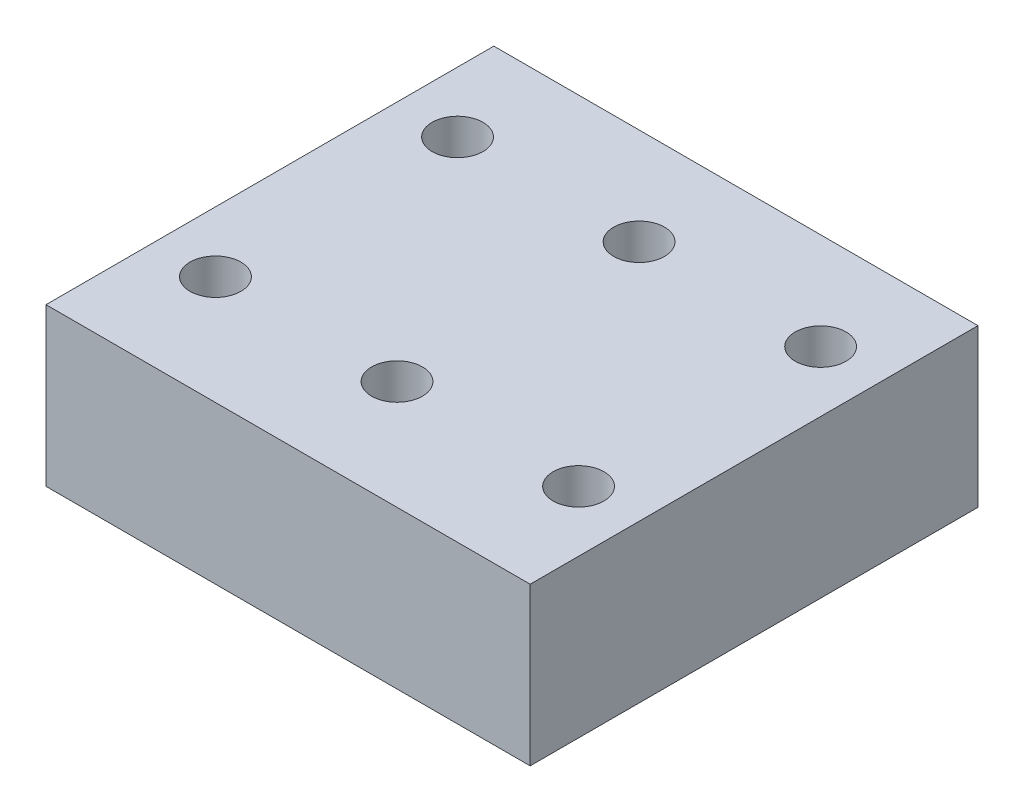
ISO-10303-21;
HEADER;
FILE_DESCRIPTION(('STEP AP214'),'2;1');
FILE_NAME('part.step','',(''),(''),'','','');
FILE_SCHEMA(('AUTOMOTIVE_DESIGN { 1 0 10303 214 1 1 1 1 }'));
ENDSEC;
DATA;
#1=APPLICATION_CONTEXT('core data for automotive mechanical design processes');
#2=APPLICATION_PROTOCOL_DEFINITION('international standard','automotive_design',2000,#1);
#3=PRODUCT_CONTEXT('',#1,'mechanical');
#4=PRODUCT('Part','Part','',(#3));
#5=PRODUCT_RELATED_PRODUCT_CATEGORY('part','',(#4));
#6=PRODUCT_DEFINITION_FORMATION('','',#4);
#7=PRODUCT_DEFINITION_CONTEXT('part definition',#1,'design');
#8=PRODUCT_DEFINITION('design','',#6,#7);
#9=PRODUCT_DEFINITION_SHAPE('','',#8);
#10=(LENGTH_UNIT() NAMED_UNIT(*) SI_UNIT(.MILLI.,.METRE.));
#11=(NAMED_UNIT(*) PLANE_ANGLE_UNIT() SI_UNIT($,.RADIAN.));
#12=(NAMED_UNIT(*) SI_UNIT($,.STERADIAN.) SOLID_ANGLE_UNIT());
#13=UNCERTAINTY_MEASURE_WITH_UNIT(LENGTH_MEASURE(1.E-05),#10,'distance_accuracy_value','');
#14=(GEOMETRIC_REPRESENTATION_CONTEXT(3) GLOBAL_UNCERTAINTY_ASSIGNED_CONTEXT((#13)) GLOBAL_UNIT_ASSIGNED_CONTEXT((#10,
#11,#12)) REPRESENTATION_CONTEXT('',''));
#15=CARTESIAN_POINT('',(0.,0.,0.));
#16=DIRECTION('',(0.,0.,1.));
#17=DIRECTION('',(1.,0.,0.));
#18=AXIS2_PLACEMENT_3D('',#15,#16,#17);
#19=CARTESIAN_POINT('',(0.,13.,0.));
#20=DIRECTION('',(0.,1.,0.));
#21=DIRECTION('',(0.,0.,1.));
#22=AXIS2_PLACEMENT_3D('',#19,#20,#21);
#23=PLANE('',#22);
#24=CARTESIAN_POINT('',(34.9999999999999,13.,8.));
#25=DIRECTION('',(0.,1.,0.));
#26=DIRECTION('',(0.,0.,1.));
#27=AXIS2_PLACEMENT_3D('',#24,#25,#26);
#28=CIRCLE('',#27,2.1);
#29=CARTESIAN_POINT('',(34.9999999999999,13.,5.9));
#30=VERTEX_POINT('',#29);
#31=EDGE_CURVE('E143',#30,#30,#28,.T.);
#32=ORIENTED_EDGE('',*,*,#31,.F.);
#33=EDGE_LOOP('',(#32));
#34=FACE_BOUND('',#33,.T.);
#35=CARTESIAN_POINT('',(19.9999999999999,13.,8.));
#36=DIRECTION('',(0.,1.,0.));
#37=DIRECTION('',(0.,0.,1.));
#38=AXIS2_PLACEMENT_3D('',#35,#36,#37);
#39=CIRCLE('',#38,2.1);
#40=CARTESIAN_POINT('',(19.9999999999999,13.,5.9));
#41=VERTEX_POINT('',#40);
#42=EDGE_CURVE('E131',#41,#41,#39,.T.);
#43=ORIENTED_EDGE('',*,*,#42,.F.);
#44=EDGE_LOOP('',(#43));
#45=FACE_BOUND('',#44,.T.);
#46=CARTESIAN_POINT('',(20.,13.,28.));
#47=DIRECTION('',(0.,1.,0.));
#48=DIRECTION('',(0.,0.,1.));
#49=AXIS2_PLACEMENT_3D('',#46,#47,#48);
#50=CIRCLE('',#49,2.1);
#51=CARTESIAN_POINT('',(20.,13.,25.9));
#52=VERTEX_POINT('',#51);
#53=EDGE_CURVE('E110',#52,#52,#50,.T.);
#54=ORIENTED_EDGE('',*,*,#53,.F.);
#55=EDGE_LOOP('',(#54));
#56=FACE_BOUND('',#55,.T.);
#57=DIRECTION('',(0.,0.,1.));
#58=VECTOR('',#57,1.);
#59=CARTESIAN_POINT('',(0.,13.,0.));
#60=LINE('',#59,#58);
#61=CARTESIAN_POINT('',(0.,13.,0.));
#62=VERTEX_POINT('',#61);
#63=CARTESIAN_POINT('',(0.,13.,37.));
#64=VERTEX_POINT('',#63);
#65=EDGE_CURVE('E95',#62,#64,#60,.T.);
#66=ORIENTED_EDGE('',*,*,#65,.T.);
#67=DIRECTION('',(1.,0.,0.));
#68=VECTOR('',#67,1.);
#69=CARTESIAN_POINT('',(0.,13.,37.));
#70=LINE('',#69,#68);
#71=CARTESIAN_POINT('',(40.,13.,37.));
#72=VERTEX_POINT('',#71);
#73=EDGE_CURVE('E90',#64,#72,#70,.T.);
#74=ORIENTED_EDGE('',*,*,#73,.T.);
#75=DIRECTION('',(0.,0.,-1.));
#76=VECTOR('',#75,1.);
#77=CARTESIAN_POINT('',(40.,13.,0.));
#78=LINE('',#77,#76);
#79=CARTESIAN_POINT('',(40.,13.,0.));
#80=VERTEX_POINT('',#79);
#81=EDGE_CURVE('E93',#72,#80,#78,.T.);
#82=ORIENTED_EDGE('',*,*,#81,.T.);
#83=DIRECTION('',(-1.,0.,0.));
#84=VECTOR('',#83,1.);
#85=CARTESIAN_POINT('',(0.,13.,0.));
#86=LINE('',#85,#84);
#87=EDGE_CURVE('E60',#80,#62,#86,.T.);
#88=ORIENTED_EDGE('',*,*,#87,.T.);
#89=EDGE_LOOP('',(#66,#74,#82,#88));
#90=FACE_BOUND('',#89,.T.);
#91=CARTESIAN_POINT('',(5.,13.,28.));
#92=DIRECTION('',(0.,1.,0.));
#93=DIRECTION('',(0.,0.,-1.));
#94=AXIS2_PLACEMENT_3D('',#91,#92,#93);
#95=CIRCLE('',#94,2.1);
#96=CARTESIAN_POINT('',(5.,13.,25.9));
#97=VERTEX_POINT('',#96);
#98=EDGE_CURVE('E125',#97,#97,#95,.T.);
#99=ORIENTED_EDGE('',*,*,#98,.F.);
#100=EDGE_LOOP('',(#99));
#101=FACE_BOUND('',#100,.T.);
#102=CARTESIAN_POINT('',(35.,13.,28.));
#103=DIRECTION('',(0.,1.,0.));
#104=DIRECTION('',(0.,0.,1.));
#105=AXIS2_PLACEMENT_3D('',#102,#103,#104);
#106=CIRCLE('',#105,2.1);
#107=CARTESIAN_POINT('',(35.,13.,25.9));
#108=VERTEX_POINT('',#107);
#109=EDGE_CURVE('E137',#108,#108,#106,.T.);
#110=ORIENTED_EDGE('',*,*,#109,.F.);
#111=EDGE_LOOP('',(#110));
#112=FACE_BOUND('',#111,.T.);
#113=CARTESIAN_POINT('',(5.00000000000007,13.,8.));
#114=DIRECTION('',(0.,1.,0.));
#115=DIRECTION('',(0.,0.,-1.));
#116=AXIS2_PLACEMENT_3D('',#113,#114,#115);
#117=CIRCLE('',#116,2.1);
#118=CARTESIAN_POINT('',(5.00000000000007,13.,5.9));
#119=VERTEX_POINT('',#118);
#120=EDGE_CURVE('E149',#119,#119,#117,.T.);
#121=ORIENTED_EDGE('',*,*,#120,.F.);
#122=EDGE_LOOP('',(#121));
#123=FACE_BOUND('',#122,.T.);
#124=ADVANCED_FACE('F43',(#34,#45,#56,#90,#101,#112,#123),#23,.T.);
#125=CARTESIAN_POINT('',(0.,0.,0.));
#126=DIRECTION('',(0.,1.,0.));
#127=DIRECTION('',(0.,0.,1.));
#128=AXIS2_PLACEMENT_3D('',#125,#126,#127);
#129=PLANE('',#128);
#130=DIRECTION('',(0.,0.,1.));
#131=VECTOR('',#130,1.);
#132=CARTESIAN_POINT('',(0.,0.,0.));
#133=LINE('',#132,#131);
#134=CARTESIAN_POINT('',(0.,0.,0.));
#135=VERTEX_POINT('',#134);
#136=CARTESIAN_POINT('',(0.,0.,37.));
#137=VERTEX_POINT('',#136);
#138=EDGE_CURVE('E107',#135,#137,#133,.T.);
#139=ORIENTED_EDGE('',*,*,#138,.F.);
#140=DIRECTION('',(-1.,0.,0.));
#141=VECTOR('',#140,1.);
#142=CARTESIAN_POINT('',(0.,0.,0.));
#143=LINE('',#142,#141);
#144=CARTESIAN_POINT('',(40.,0.,0.));
#145=VERTEX_POINT('',#144);
#146=EDGE_CURVE('E83',#145,#135,#143,.T.);
#147=ORIENTED_EDGE('',*,*,#146,.F.);
#148=DIRECTION('',(0.,0.,-1.));
#149=VECTOR('',#148,1.);
#150=CARTESIAN_POINT('',(40.,0.,0.));
#151=LINE('',#150,#149);
#152=CARTESIAN_POINT('',(40.,0.,37.));
#153=VERTEX_POINT('',#152);
#154=EDGE_CURVE('E77',#153,#145,#151,.T.);
#155=ORIENTED_EDGE('',*,*,#154,.F.);
#156=DIRECTION('',(1.,0.,0.));
#157=VECTOR('',#156,1.);
#158=CARTESIAN_POINT('',(0.,0.,37.));
#159=LINE('',#158,#157);
#160=EDGE_CURVE('E99',#137,#153,#159,.T.);
#161=ORIENTED_EDGE('',*,*,#160,.F.);
#162=EDGE_LOOP('',(#139,#147,#155,#161));
#163=FACE_BOUND('',#162,.T.);
#164=CARTESIAN_POINT('',(20.,0.,28.));
#165=DIRECTION('',(0.,1.,0.));
#166=DIRECTION('',(0.,0.,1.));
#167=AXIS2_PLACEMENT_3D('',#164,#165,#166);
#168=CIRCLE('',#167,2.1);
#169=CARTESIAN_POINT('',(20.,0.,25.9));
#170=VERTEX_POINT('',#169);
#171=EDGE_CURVE('E122',#170,#170,#168,.T.);
#172=ORIENTED_EDGE('',*,*,#171,.T.);
#173=EDGE_LOOP('',(#172));
#174=FACE_BOUND('',#173,.T.);
#175=CARTESIAN_POINT('',(5.,0.,28.));
#176=DIRECTION('',(0.,1.,0.));
#177=DIRECTION('',(0.,0.,-1.));
#178=AXIS2_PLACEMENT_3D('',#175,#176,#177);
#179=CIRCLE('',#178,2.1);
#180=CARTESIAN_POINT('',(5.,0.,25.9));
#181=VERTEX_POINT('',#180);
#182=EDGE_CURVE('E128',#181,#181,#179,.T.);
#183=ORIENTED_EDGE('',*,*,#182,.T.);
#184=EDGE_LOOP('',(#183));
#185=FACE_BOUND('',#184,.T.);
#186=CARTESIAN_POINT('',(19.9999999999999,0.,8.));
#187=DIRECTION('',(0.,1.,0.));
#188=DIRECTION('',(0.,0.,1.));
#189=AXIS2_PLACEMENT_3D('',#186,#187,#188);
#190=CIRCLE('',#189,2.1);
#191=CARTESIAN_POINT('',(19.9999999999999,0.,5.9));
#192=VERTEX_POINT('',#191);
#193=EDGE_CURVE('E134',#192,#192,#190,.T.);
#194=ORIENTED_EDGE('',*,*,#193,.T.);
#195=EDGE_LOOP('',(#194));
#196=FACE_BOUND('',#195,.T.);
#197=CARTESIAN_POINT('',(35.,0.,28.));
#198=DIRECTION('',(0.,1.,0.));
#199=DIRECTION('',(0.,0.,1.));
#200=AXIS2_PLACEMENT_3D('',#197,#198,#199);
#201=CIRCLE('',#200,2.1);
#202=CARTESIAN_POINT('',(35.,0.,25.9));
#203=VERTEX_POINT('',#202);
#204=EDGE_CURVE('E140',#203,#203,#201,.T.);
#205=ORIENTED_EDGE('',*,*,#204,.T.);
#206=EDGE_LOOP('',(#205));
#207=FACE_BOUND('',#206,.T.);
#208=CARTESIAN_POINT('',(34.9999999999999,0.,8.));
#209=DIRECTION('',(0.,1.,0.));
#210=DIRECTION('',(0.,0.,1.));
#211=AXIS2_PLACEMENT_3D('',#208,#209,#210);
#212=CIRCLE('',#211,2.1);
#213=CARTESIAN_POINT('',(34.9999999999999,0.,5.9));
#214=VERTEX_POINT('',#213);
#215=EDGE_CURVE('E146',#214,#214,#212,.T.);
#216=ORIENTED_EDGE('',*,*,#215,.T.);
#217=EDGE_LOOP('',(#216));
#218=FACE_BOUND('',#217,.T.);
#219=CARTESIAN_POINT('',(5.00000000000007,0.,8.));
#220=DIRECTION('',(0.,1.,0.));
#221=DIRECTION('',(0.,0.,-1.));
#222=AXIS2_PLACEMENT_3D('',#219,#220,#221);
#223=CIRCLE('',#222,2.1);
#224=CARTESIAN_POINT('',(5.00000000000007,0.,5.9));
#225=VERTEX_POINT('',#224);
#226=EDGE_CURVE('E152',#225,#225,#223,.T.);
#227=ORIENTED_EDGE('',*,*,#226,.T.);
#228=EDGE_LOOP('',(#227));
#229=FACE_BOUND('',#228,.T.);
#230=ADVANCED_FACE('F118',(#163,#174,#185,#196,#207,#218,#229),#129,.F.);
#231=CARTESIAN_POINT('',(0.,13.,0.));
#232=DIRECTION('',(1.,0.,0.));
#233=DIRECTION('',(0.,0.,-1.));
#234=AXIS2_PLACEMENT_3D('',#231,#232,#233);
#235=PLANE('',#234);
#236=ORIENTED_EDGE('',*,*,#138,.T.);
#237=DIRECTION('',(0.,-1.,0.));
#238=VECTOR('',#237,1.);
#239=CARTESIAN_POINT('',(0.,13.,37.));
#240=LINE('',#239,#238);
#241=EDGE_CURVE('E11',#64,#137,#240,.T.);
#242=ORIENTED_EDGE('',*,*,#241,.F.);
#243=ORIENTED_EDGE('',*,*,#65,.F.);
#244=DIRECTION('',(0.,-1.,0.));
#245=VECTOR('',#244,1.);
#246=CARTESIAN_POINT('',(0.,13.,0.));
#247=LINE('',#246,#245);
#248=EDGE_CURVE('E103',#62,#135,#247,.T.);
#249=ORIENTED_EDGE('',*,*,#248,.T.);
#250=EDGE_LOOP('',(#236,#242,#243,#249));
#251=FACE_BOUND('',#250,.T.);
#252=ADVANCED_FACE('F45',(#251),#235,.F.);
#253=CARTESIAN_POINT('',(0.,13.,37.));
#254=DIRECTION('',(0.,0.,-1.));
#255=DIRECTION('',(-1.,0.,0.));
#256=AXIS2_PLACEMENT_3D('',#253,#254,#255);
#257=PLANE('',#256);
#258=ORIENTED_EDGE('',*,*,#160,.T.);
#259=DIRECTION('',(0.,-1.,0.));
#260=VECTOR('',#259,1.);
#261=CARTESIAN_POINT('',(40.,13.,37.));
#262=LINE('',#261,#260);
#263=EDGE_CURVE('E52',#72,#153,#262,.T.);
#264=ORIENTED_EDGE('',*,*,#263,.F.);
#265=ORIENTED_EDGE('',*,*,#73,.F.);
#266=ORIENTED_EDGE('',*,*,#241,.T.);
#267=EDGE_LOOP('',(#258,#264,#265,#266));
#268=FACE_BOUND('',#267,.T.);
#269=ADVANCED_FACE('F98',(#268),#257,.F.);
#270=CARTESIAN_POINT('',(40.,13.,0.));
#271=DIRECTION('',(-1.,0.,0.));
#272=DIRECTION('',(0.,0.,1.));
#273=AXIS2_PLACEMENT_3D('',#270,#271,#272);
#274=PLANE('',#273);
#275=ORIENTED_EDGE('',*,*,#154,.T.);
#276=DIRECTION('',(0.,-1.,0.));
#277=VECTOR('',#276,1.);
#278=CARTESIAN_POINT('',(40.,13.,0.));
#279=LINE('',#278,#277);
#280=EDGE_CURVE('E100',#80,#145,#279,.T.);
#281=ORIENTED_EDGE('',*,*,#280,.F.);
#282=ORIENTED_EDGE('',*,*,#81,.F.);
#283=ORIENTED_EDGE('',*,*,#263,.T.);
#284=EDGE_LOOP('',(#275,#281,#282,#283));
#285=FACE_BOUND('',#284,.T.);
#286=ADVANCED_FACE('F101',(#285),#274,.F.);
#287=CARTESIAN_POINT('',(0.,13.,0.));
#288=DIRECTION('',(0.,0.,1.));
#289=DIRECTION('',(1.,0.,0.));
#290=AXIS2_PLACEMENT_3D('',#287,#288,#289);
#291=PLANE('',#290);
#292=ORIENTED_EDGE('',*,*,#146,.T.);
#293=ORIENTED_EDGE('',*,*,#248,.F.);
#294=ORIENTED_EDGE('',*,*,#87,.F.);
#295=ORIENTED_EDGE('',*,*,#280,.T.);
#296=EDGE_LOOP('',(#292,#293,#294,#295));
#297=FACE_BOUND('',#296,.T.);
#298=ADVANCED_FACE('F115',(#297),#291,.F.);
#299=CARTESIAN_POINT('',(20.,13.,28.));
#300=DIRECTION('',(0.,-1.,0.));
#301=DIRECTION('',(0.,0.,-1.));
#302=AXIS2_PLACEMENT_3D('',#299,#300,#301);
#303=CYLINDRICAL_SURFACE('',#302,2.1);
#304=CARTESIAN_POINT('',(20.,13.,25.9));
#305=CARTESIAN_POINT('',(20.,12.8645833333333,25.9));
#306=CARTESIAN_POINT('',(20.,12.7291666666667,25.9));
#307=CARTESIAN_POINT('',(20.,12.4583333333333,25.9));
#308=CARTESIAN_POINT('',(20.,12.3229166666667,25.9));
#309=CARTESIAN_POINT('',(20.,12.0520833333333,25.9));
#310=CARTESIAN_POINT('',(20.,11.9166666666667,25.9));
#311=CARTESIAN_POINT('',(20.,11.6458333333333,25.9));
#312=CARTESIAN_POINT('',(20.,11.5104166666667,25.9));
#313=CARTESIAN_POINT('',(20.,11.2395833333333,25.9));
#314=CARTESIAN_POINT('',(20.,11.1041666666667,25.9));
#315=CARTESIAN_POINT('',(20.,10.8333333333333,25.9));
#316=CARTESIAN_POINT('',(20.,10.6979166666667,25.9));
#317=CARTESIAN_POINT('',(20.,10.4270833333333,25.9));
#318=CARTESIAN_POINT('',(20.,10.2916666666667,25.9));
#319=CARTESIAN_POINT('',(20.,10.0208333333333,25.9));
#320=CARTESIAN_POINT('',(20.,9.88541666666667,25.9));
#321=CARTESIAN_POINT('',(20.,9.61458333333333,25.9));
#322=CARTESIAN_POINT('',(20.,9.47916666666667,25.9));
#323=CARTESIAN_POINT('',(20.,9.20833333333333,25.9));
#324=CARTESIAN_POINT('',(20.,9.07291666666666,25.9));
#325=CARTESIAN_POINT('',(20.,8.80208333333333,25.9));
#326=CARTESIAN_POINT('',(20.,8.66666666666667,25.9));
#327=CARTESIAN_POINT('',(20.,8.39583333333333,25.9));
#328=CARTESIAN_POINT('',(20.,8.26041666666667,25.9));
#329=CARTESIAN_POINT('',(20.,7.98958333333333,25.9));
#330=CARTESIAN_POINT('',(20.,7.85416666666667,25.9));
#331=CARTESIAN_POINT('',(20.,7.58333333333333,25.9));
#332=CARTESIAN_POINT('',(20.,7.44791666666667,25.9));
#333=CARTESIAN_POINT('',(20.,7.17708333333333,25.9));
#334=CARTESIAN_POINT('',(20.,7.04166666666667,25.9));
#335=CARTESIAN_POINT('',(20.,6.77083333333333,25.9));
#336=CARTESIAN_POINT('',(20.,6.63541666666667,25.9));
#337=CARTESIAN_POINT('',(20.,6.36458333333333,25.9));
#338=CARTESIAN_POINT('',(20.,6.22916666666667,25.9));
#339=CARTESIAN_POINT('',(20.,5.95833333333333,25.9));
#340=CARTESIAN_POINT('',(20.,5.82291666666667,25.9));
#341=CARTESIAN_POINT('',(20.,5.55208333333333,25.9));
#342=CARTESIAN_POINT('',(20.,5.41666666666667,25.9));
#343=CARTESIAN_POINT('',(20.,5.14583333333333,25.9));
#344=CARTESIAN_POINT('',(20.,5.01041666666667,25.9));
#345=CARTESIAN_POINT('',(20.,4.73958333333333,25.9));
#346=CARTESIAN_POINT('',(20.,4.60416666666667,25.9));
#347=CARTESIAN_POINT('',(20.,4.33333333333333,25.9));
#348=CARTESIAN_POINT('',(20.,4.19791666666667,25.9));
#349=CARTESIAN_POINT('',(20.,3.92708333333333,25.9));
#350=CARTESIAN_POINT('',(20.,3.79166666666667,25.9));
#351=CARTESIAN_POINT('',(20.,3.52083333333333,25.9));
#352=CARTESIAN_POINT('',(20.,3.38541666666667,25.9));
#353=CARTESIAN_POINT('',(20.,3.11458333333333,25.9));
#354=CARTESIAN_POINT('',(20.,2.97916666666667,25.9));
#355=CARTESIAN_POINT('',(20.,2.70833333333333,25.9));
#356=CARTESIAN_POINT('',(20.,2.57291666666667,25.9));
#357=CARTESIAN_POINT('',(20.,2.30208333333333,25.9));
#358=CARTESIAN_POINT('',(20.,2.16666666666667,25.9));
#359=CARTESIAN_POINT('',(20.,1.89583333333333,25.9));
#360=CARTESIAN_POINT('',(20.,1.76041666666667,25.9));
#361=CARTESIAN_POINT('',(20.,1.48958333333333,25.9));
#362=CARTESIAN_POINT('',(20.,1.35416666666667,25.9));
#363=CARTESIAN_POINT('',(20.,1.08333333333333,25.9));
#364=CARTESIAN_POINT('',(20.,0.947916666666667,25.9));
#365=CARTESIAN_POINT('',(20.,0.677083333333334,25.9));
#366=CARTESIAN_POINT('',(20.,0.541666666666667,25.9));
#367=CARTESIAN_POINT('',(20.,0.270833333333334,25.9));
#368=CARTESIAN_POINT('',(20.,0.135416666666667,25.9));
#369=CARTESIAN_POINT('',(20.,0.,25.9));
#370=B_SPLINE_CURVE_WITH_KNOTS('',3,(#304,#305,#306,#307,#308,#309,#310,#311,#312,#313,#314,
#315,#316,#317,#318,#319,#320,#321,#322,#323,#324,#325,#326,#327,#328,#329,#330,#331,#332,#333,
#334,#335,#336,#337,#338,#339,#340,#341,#342,#343,#344,#345,#346,#347,#348,#349,#350,#351,#352,
#353,#354,#355,#356,#357,#358,#359,#360,#361,#362,#363,#364,#365,#366,#367,#368,#369),
.UNSPECIFIED.,.F.,.F.,(4,2,2,2,2,2,2,2,2,2,2,2,2,2,2,2,2,2,2,2,2,2,2,2,2,2,2,2,2,2,2,2,4),(0.,
0.40625,0.812500000000001,1.21875,1.625,2.03125,2.4375,2.84375,3.25,3.65625,4.0625,4.46875,
4.875,5.28125,5.6875,6.09375,6.5,6.90625,7.3125,7.71875,8.125,8.53125,8.9375,9.34375,9.75,
10.15625,10.5625,10.96875,11.375,11.78125,12.1875,12.59375,13.),.UNSPECIFIED.);
#371=EDGE_CURVE('BSEAM171',#52,#170,#370,.T.);
#372=ORIENTED_EDGE('',*,*,#53,.T.);
#373=ORIENTED_EDGE('',*,*,#171,.F.);
#374=ORIENTED_EDGE('',*,*,#371,.T.);
#375=ORIENTED_EDGE('',*,*,#371,.F.);
#376=EDGE_LOOP('',(#372,#374,#373,#375));
#377=FACE_BOUND('',#376,.T.);
#378=ADVANCED_FACE('F171',(#377),#303,.F.);
#379=CARTESIAN_POINT('',(5.,13.,28.));
#380=DIRECTION('',(0.,-1.,0.));
#381=DIRECTION('',(0.,0.,-1.));
#382=AXIS2_PLACEMENT_3D('',#379,#380,#381);
#383=CYLINDRICAL_SURFACE('',#382,2.1);
#384=CARTESIAN_POINT('',(5.,13.,25.9));
#385=CARTESIAN_POINT('',(5.,12.8645833333333,25.9));
#386=CARTESIAN_POINT('',(5.,12.7291666666667,25.9));
#387=CARTESIAN_POINT('',(5.,12.4583333333333,25.9));
#388=CARTESIAN_POINT('',(5.,12.3229166666667,25.9));
#389=CARTESIAN_POINT('',(5.,12.0520833333333,25.9));
#390=CARTESIAN_POINT('',(5.,11.9166666666667,25.9));
#391=CARTESIAN_POINT('',(5.,11.6458333333333,25.9));
#392=CARTESIAN_POINT('',(5.,11.5104166666667,25.9));
#393=CARTESIAN_POINT('',(5.,11.2395833333333,25.9));
#394=CARTESIAN_POINT('',(5.,11.1041666666667,25.9));
#395=CARTESIAN_POINT('',(5.,10.8333333333333,25.9));
#396=CARTESIAN_POINT('',(5.,10.6979166666667,25.9));
#397=CARTESIAN_POINT('',(5.,10.4270833333333,25.9));
#398=CARTESIAN_POINT('',(5.,10.2916666666667,25.9));
#399=CARTESIAN_POINT('',(5.,10.0208333333333,25.9));
#400=CARTESIAN_POINT('',(5.,9.88541666666667,25.9));
#401=CARTESIAN_POINT('',(5.,9.61458333333333,25.9));
#402=CARTESIAN_POINT('',(5.,9.47916666666667,25.9));
#403=CARTESIAN_POINT('',(5.,9.20833333333333,25.9));
#404=CARTESIAN_POINT('',(5.,9.07291666666666,25.9));
#405=CARTESIAN_POINT('',(5.,8.80208333333333,25.9));
#406=CARTESIAN_POINT('',(5.,8.66666666666667,25.9));
#407=CARTESIAN_POINT('',(5.,8.39583333333333,25.9));
#408=CARTESIAN_POINT('',(5.,8.26041666666667,25.9));
#409=CARTESIAN_POINT('',(5.,7.98958333333333,25.9));
#410=CARTESIAN_POINT('',(5.,7.85416666666667,25.9));
#411=CARTESIAN_POINT('',(5.,7.58333333333333,25.9));
#412=CARTESIAN_POINT('',(5.,7.44791666666667,25.9));
#413=CARTESIAN_POINT('',(5.,7.17708333333333,25.9));
#414=CARTESIAN_POINT('',(5.,7.04166666666667,25.9));
#415=CARTESIAN_POINT('',(5.,6.77083333333333,25.9));
#416=CARTESIAN_POINT('',(5.,6.63541666666667,25.9));
#417=CARTESIAN_POINT('',(5.,6.36458333333333,25.9));
#418=CARTESIAN_POINT('',(5.,6.22916666666667,25.9));
#419=CARTESIAN_POINT('',(5.,5.95833333333333,25.9));
#420=CARTESIAN_POINT('',(5.,5.82291666666667,25.9));
#421=CARTESIAN_POINT('',(5.,5.55208333333333,25.9));
#422=CARTESIAN_POINT('',(5.,5.41666666666667,25.9));
#423=CARTESIAN_POINT('',(5.,5.14583333333333,25.9));
#424=CARTESIAN_POINT('',(5.,5.01041666666667,25.9));
#425=CARTESIAN_POINT('',(5.,4.73958333333333,25.9));
#426=CARTESIAN_POINT('',(5.,4.60416666666667,25.9));
#427=CARTESIAN_POINT('',(5.,4.33333333333333,25.9));
#428=CARTESIAN_POINT('',(5.,4.19791666666667,25.9));
#429=CARTESIAN_POINT('',(5.,3.92708333333333,25.9));
#430=CARTESIAN_POINT('',(5.,3.79166666666667,25.9));
#431=CARTESIAN_POINT('',(5.,3.52083333333333,25.9));
#432=CARTESIAN_POINT('',(5.,3.38541666666667,25.9));
#433=CARTESIAN_POINT('',(5.,3.11458333333333,25.9));
#434=CARTESIAN_POINT('',(5.,2.97916666666667,25.9));
#435=CARTESIAN_POINT('',(5.,2.70833333333333,25.9));
#436=CARTESIAN_POINT('',(5.,2.57291666666667,25.9));
#437=CARTESIAN_POINT('',(5.,2.30208333333333,25.9));
#438=CARTESIAN_POINT('',(5.,2.16666666666667,25.9));
#439=CARTESIAN_POINT('',(5.,1.89583333333333,25.9));
#440=CARTESIAN_POINT('',(5.,1.76041666666667,25.9));
#441=CARTESIAN_POINT('',(5.,1.48958333333333,25.9));
#442=CARTESIAN_POINT('',(5.,1.35416666666667,25.9));
#443=CARTESIAN_POINT('',(5.,1.08333333333333,25.9));
#444=CARTESIAN_POINT('',(5.,0.947916666666667,25.9));
#445=CARTESIAN_POINT('',(5.,0.677083333333334,25.9));
#446=CARTESIAN_POINT('',(5.,0.541666666666667,25.9));
#447=CARTESIAN_POINT('',(5.,0.270833333333334,25.9));
#448=CARTESIAN_POINT('',(5.,0.135416666666667,25.9));
#449=CARTESIAN_POINT('',(5.,0.,25.9));
#450=B_SPLINE_CURVE_WITH_KNOTS('',3,(#384,#385,#386,#387,#388,#389,#390,#391,#392,#393,#394,
#395,#396,#397,#398,#399,#400,#401,#402,#403,#404,#405,#406,#407,#408,#409,#410,#411,#412,#413,
#414,#415,#416,#417,#418,#419,#420,#421,#422,#423,#424,#425,#426,#427,#428,#429,#430,#431,#432,
#433,#434,#435,#436,#437,#438,#439,#440,#441,#442,#443,#444,#445,#446,#447,#448,#449),
.UNSPECIFIED.,.F.,.F.,(4,2,2,2,2,2,2,2,2,2,2,2,2,2,2,2,2,2,2,2,2,2,2,2,2,2,2,2,2,2,2,2,4),(0.,
0.40625,0.812500000000001,1.21875,1.625,2.03125,2.4375,2.84375,3.25,3.65625,4.0625,4.46875,
4.875,5.28125,5.6875,6.09375,6.5,6.90625,7.3125,7.71875,8.125,8.53125,8.9375,9.34375,9.75,
10.15625,10.5625,10.96875,11.375,11.78125,12.1875,12.59375,13.),.UNSPECIFIED.);
#451=EDGE_CURVE('BSEAM216',#97,#181,#450,.T.);
#452=ORIENTED_EDGE('',*,*,#98,.T.);
#453=ORIENTED_EDGE('',*,*,#182,.F.);
#454=ORIENTED_EDGE('',*,*,#451,.T.);
#455=ORIENTED_EDGE('',*,*,#451,.F.);
#456=EDGE_LOOP('',(#452,#454,#453,#455));
#457=FACE_BOUND('',#456,.T.);
#458=ADVANCED_FACE('F216',(#457),#383,.F.);
#459=CARTESIAN_POINT('',(19.9999999999999,13.,8.));
#460=DIRECTION('',(0.,-1.,0.));
#461=DIRECTION('',(0.,0.,-1.));
#462=AXIS2_PLACEMENT_3D('',#459,#460,#461);
#463=CYLINDRICAL_SURFACE('',#462,2.1);
#464=CARTESIAN_POINT('',(19.9999999999999,13.,5.9));
#465=CARTESIAN_POINT('',(19.9999999999999,12.8645833333333,5.9));
#466=CARTESIAN_POINT('',(19.9999999999999,12.7291666666667,5.9));
#467=CARTESIAN_POINT('',(19.9999999999999,12.4583333333333,5.9));
#468=CARTESIAN_POINT('',(19.9999999999999,12.3229166666667,5.9));
#469=CARTESIAN_POINT('',(19.9999999999999,12.0520833333333,5.9));
#470=CARTESIAN_POINT('',(19.9999999999999,11.9166666666667,5.9));
#471=CARTESIAN_POINT('',(19.9999999999999,11.6458333333333,5.9));
#472=CARTESIAN_POINT('',(19.9999999999999,11.5104166666667,5.9));
#473=CARTESIAN_POINT('',(19.9999999999999,11.2395833333333,5.9));
#474=CARTESIAN_POINT('',(19.9999999999999,11.1041666666667,5.9));
#475=CARTESIAN_POINT('',(19.9999999999999,10.8333333333333,5.9));
#476=CARTESIAN_POINT('',(19.9999999999999,10.6979166666667,5.9));
#477=CARTESIAN_POINT('',(19.9999999999999,10.4270833333333,5.9));
#478=CARTESIAN_POINT('',(19.9999999999999,10.2916666666667,5.9));
#479=CARTESIAN_POINT('',(19.9999999999999,10.0208333333333,5.9));
#480=CARTESIAN_POINT('',(19.9999999999999,9.88541666666667,5.9));
#481=CARTESIAN_POINT('',(19.9999999999999,9.61458333333333,5.9));
#482=CARTESIAN_POINT('',(19.9999999999999,9.47916666666667,5.9));
#483=CARTESIAN_POINT('',(19.9999999999999,9.20833333333333,5.9));
#484=CARTESIAN_POINT('',(19.9999999999999,9.07291666666666,5.9));
#485=CARTESIAN_POINT('',(19.9999999999999,8.80208333333333,5.9));
#486=CARTESIAN_POINT('',(19.9999999999999,8.66666666666667,5.9));
#487=CARTESIAN_POINT('',(19.9999999999999,8.39583333333333,5.9));
#488=CARTESIAN_POINT('',(19.9999999999999,8.26041666666667,5.9));
#489=CARTESIAN_POINT('',(19.9999999999999,7.98958333333333,5.9));
#490=CARTESIAN_POINT('',(19.9999999999999,7.85416666666667,5.9));
#491=CARTESIAN_POINT('',(19.9999999999999,7.58333333333333,5.9));
#492=CARTESIAN_POINT('',(19.9999999999999,7.44791666666667,5.9));
#493=CARTESIAN_POINT('',(19.9999999999999,7.17708333333333,5.9));
#494=CARTESIAN_POINT('',(19.9999999999999,7.04166666666667,5.9));
#495=CARTESIAN_POINT('',(19.9999999999999,6.77083333333333,5.9));
#496=CARTESIAN_POINT('',(19.9999999999999,6.63541666666667,5.9));
#497=CARTESIAN_POINT('',(19.9999999999999,6.36458333333333,5.9));
#498=CARTESIAN_POINT('',(19.9999999999999,6.22916666666667,5.9));
#499=CARTESIAN_POINT('',(19.9999999999999,5.95833333333333,5.9));
#500=CARTESIAN_POINT('',(19.9999999999999,5.82291666666667,5.9));
#501=CARTESIAN_POINT('',(19.9999999999999,5.55208333333333,5.9));
#502=CARTESIAN_POINT('',(19.9999999999999,5.41666666666667,5.9));
#503=CARTESIAN_POINT('',(19.9999999999999,5.14583333333333,5.9));
#504=CARTESIAN_POINT('',(19.9999999999999,5.01041666666667,5.9));
#505=CARTESIAN_POINT('',(19.9999999999999,4.73958333333333,5.9));
#506=CARTESIAN_POINT('',(19.9999999999999,4.60416666666667,5.9));
#507=CARTESIAN_POINT('',(19.9999999999999,4.33333333333333,5.9));
#508=CARTESIAN_POINT('',(19.9999999999999,4.19791666666667,5.9));
#509=CARTESIAN_POINT('',(19.9999999999999,3.92708333333333,5.9));
#510=CARTESIAN_POINT('',(19.9999999999999,3.79166666666667,5.9));
#511=CARTESIAN_POINT('',(19.9999999999999,3.52083333333333,5.9));
#512=CARTESIAN_POINT('',(19.9999999999999,3.38541666666667,5.9));
#513=CARTESIAN_POINT('',(19.9999999999999,3.11458333333333,5.9));
#514=CARTESIAN_POINT('',(19.9999999999999,2.97916666666667,5.9));
#515=CARTESIAN_POINT('',(19.9999999999999,2.70833333333333,5.9));
#516=CARTESIAN_POINT('',(19.9999999999999,2.57291666666667,5.9));
#517=CARTESIAN_POINT('',(19.9999999999999,2.30208333333333,5.9));
#518=CARTESIAN_POINT('',(19.9999999999999,2.16666666666667,5.9));
#519=CARTESIAN_POINT('',(19.9999999999999,1.89583333333333,5.9));
#520=CARTESIAN_POINT('',(19.9999999999999,1.76041666666667,5.9));
#521=CARTESIAN_POINT('',(19.9999999999999,1.48958333333333,5.9));
#522=CARTESIAN_POINT('',(19.9999999999999,1.35416666666667,5.9));
#523=CARTESIAN_POINT('',(19.9999999999999,1.08333333333333,5.9));
#524=CARTESIAN_POINT('',(19.9999999999999,0.947916666666667,5.9));
#525=CARTESIAN_POINT('',(19.9999999999999,0.677083333333334,5.9));
#526=CARTESIAN_POINT('',(19.9999999999999,0.541666666666667,5.9));
#527=CARTESIAN_POINT('',(19.9999999999999,0.270833333333334,5.9));
#528=CARTESIAN_POINT('',(19.9999999999999,0.135416666666667,5.9));
#529=CARTESIAN_POINT('',(19.9999999999999,0.,5.9));
#530=B_SPLINE_CURVE_WITH_KNOTS('',3,(#464,#465,#466,#467,#468,#469,#470,#471,#472,#473,#474,
#475,#476,#477,#478,#479,#480,#481,#482,#483,#484,#485,#486,#487,#488,#489,#490,#491,#492,#493,
#494,#495,#496,#497,#498,#499,#500,#501,#502,#503,#504,#505,#506,#507,#508,#509,#510,#511,#512,
#513,#514,#515,#516,#517,#518,#519,#520,#521,#522,#523,#524,#525,#526,#527,#528,#529),
.UNSPECIFIED.,.F.,.F.,(4,2,2,2,2,2,2,2,2,2,2,2,2,2,2,2,2,2,2,2,2,2,2,2,2,2,2,2,2,2,2,2,4),(0.,
0.40625,0.812500000000001,1.21875,1.625,2.03125,2.4375,2.84375,3.25,3.65625,4.0625,4.46875,
4.875,5.28125,5.6875,6.09375,6.5,6.90625,7.3125,7.71875,8.125,8.53125,8.9375,9.34375,9.75,
10.15625,10.5625,10.96875,11.375,11.78125,12.1875,12.59375,13.),.UNSPECIFIED.);
#531=EDGE_CURVE('BSEAM224',#41,#192,#530,.T.);
#532=ORIENTED_EDGE('',*,*,#42,.T.);
#533=ORIENTED_EDGE('',*,*,#193,.F.);
#534=ORIENTED_EDGE('',*,*,#531,.T.);
#535=ORIENTED_EDGE('',*,*,#531,.F.);
#536=EDGE_LOOP('',(#532,#534,#533,#535));
#537=FACE_BOUND('',#536,.T.);
#538=ADVANCED_FACE('F224',(#537),#463,.F.);
#539=CARTESIAN_POINT('',(35.,13.,28.));
#540=DIRECTION('',(0.,-1.,0.));
#541=DIRECTION('',(0.,0.,-1.));
#542=AXIS2_PLACEMENT_3D('',#539,#540,#541);
#543=CYLINDRICAL_SURFACE('',#542,2.1);
#544=CARTESIAN_POINT('',(35.,13.,25.9));
#545=CARTESIAN_POINT('',(35.,12.8645833333333,25.9));
#546=CARTESIAN_POINT('',(35.,12.7291666666667,25.9));
#547=CARTESIAN_POINT('',(35.,12.4583333333333,25.9));
#548=CARTESIAN_POINT('',(35.,12.3229166666667,25.9));
#549=CARTESIAN_POINT('',(35.,12.0520833333333,25.9));
#550=CARTESIAN_POINT('',(35.,11.9166666666667,25.9));
#551=CARTESIAN_POINT('',(35.,11.6458333333333,25.9));
#552=CARTESIAN_POINT('',(35.,11.5104166666667,25.9));
#553=CARTESIAN_POINT('',(35.,11.2395833333333,25.9));
#554=CARTESIAN_POINT('',(35.,11.1041666666667,25.9));
#555=CARTESIAN_POINT('',(35.,10.8333333333333,25.9));
#556=CARTESIAN_POINT('',(35.,10.6979166666667,25.9));
#557=CARTESIAN_POINT('',(35.,10.4270833333333,25.9));
#558=CARTESIAN_POINT('',(35.,10.2916666666667,25.9));
#559=CARTESIAN_POINT('',(35.,10.0208333333333,25.9));
#560=CARTESIAN_POINT('',(35.,9.88541666666667,25.9));
#561=CARTESIAN_POINT('',(35.,9.61458333333333,25.9));
#562=CARTESIAN_POINT('',(35.,9.47916666666667,25.9));
#563=CARTESIAN_POINT('',(35.,9.20833333333333,25.9));
#564=CARTESIAN_POINT('',(35.,9.07291666666666,25.9));
#565=CARTESIAN_POINT('',(35.,8.80208333333333,25.9));
#566=CARTESIAN_POINT('',(35.,8.66666666666667,25.9));
#567=CARTESIAN_POINT('',(35.,8.39583333333333,25.9));
#568=CARTESIAN_POINT('',(35.,8.26041666666667,25.9));
#569=CARTESIAN_POINT('',(35.,7.98958333333333,25.9));
#570=CARTESIAN_POINT('',(35.,7.85416666666667,25.9));
#571=CARTESIAN_POINT('',(35.,7.58333333333333,25.9));
#572=CARTESIAN_POINT('',(35.,7.44791666666667,25.9));
#573=CARTESIAN_POINT('',(35.,7.17708333333333,25.9));
#574=CARTESIAN_POINT('',(35.,7.04166666666667,25.9));
#575=CARTESIAN_POINT('',(35.,6.77083333333333,25.9));
#576=CARTESIAN_POINT('',(35.,6.63541666666667,25.9));
#577=CARTESIAN_POINT('',(35.,6.36458333333333,25.9));
#578=CARTESIAN_POINT('',(35.,6.22916666666667,25.9));
#579=CARTESIAN_POINT('',(35.,5.95833333333333,25.9));
#580=CARTESIAN_POINT('',(35.,5.82291666666667,25.9));
#581=CARTESIAN_POINT('',(35.,5.55208333333333,25.9));
#582=CARTESIAN_POINT('',(35.,5.41666666666667,25.9));
#583=CARTESIAN_POINT('',(35.,5.14583333333333,25.9));
#584=CARTESIAN_POINT('',(35.,5.01041666666667,25.9));
#585=CARTESIAN_POINT('',(35.,4.73958333333333,25.9));
#586=CARTESIAN_POINT('',(35.,4.60416666666667,25.9));
#587=CARTESIAN_POINT('',(35.,4.33333333333333,25.9));
#588=CARTESIAN_POINT('',(35.,4.19791666666667,25.9));
#589=CARTESIAN_POINT('',(35.,3.92708333333333,25.9));
#590=CARTESIAN_POINT('',(35.,3.79166666666667,25.9));
#591=CARTESIAN_POINT('',(35.,3.52083333333333,25.9));
#592=CARTESIAN_POINT('',(35.,3.38541666666667,25.9));
#593=CARTESIAN_POINT('',(35.,3.11458333333333,25.9));
#594=CARTESIAN_POINT('',(35.,2.97916666666667,25.9));
#595=CARTESIAN_POINT('',(35.,2.70833333333333,25.9));
#596=CARTESIAN_POINT('',(35.,2.57291666666667,25.9));
#597=CARTESIAN_POINT('',(35.,2.30208333333333,25.9));
#598=CARTESIAN_POINT('',(35.,2.16666666666667,25.9));
#599=CARTESIAN_POINT('',(35.,1.89583333333333,25.9));
#600=CARTESIAN_POINT('',(35.,1.76041666666667,25.9));
#601=CARTESIAN_POINT('',(35.,1.48958333333333,25.9));
#602=CARTESIAN_POINT('',(35.,1.35416666666667,25.9));
#603=CARTESIAN_POINT('',(35.,1.08333333333333,25.9));
#604=CARTESIAN_POINT('',(35.,0.947916666666667,25.9));
#605=CARTESIAN_POINT('',(35.,0.677083333333334,25.9));
#606=CARTESIAN_POINT('',(35.,0.541666666666667,25.9));
#607=CARTESIAN_POINT('',(35.,0.270833333333334,25.9));
#608=CARTESIAN_POINT('',(35.,0.135416666666667,25.9));
#609=CARTESIAN_POINT('',(35.,0.,25.9));
#610=B_SPLINE_CURVE_WITH_KNOTS('',3,(#544,#545,#546,#547,#548,#549,#550,#551,#552,#553,#554,
#555,#556,#557,#558,#559,#560,#561,#562,#563,#564,#565,#566,#567,#568,#569,#570,#571,#572,#573,
#574,#575,#576,#577,#578,#579,#580,#581,#582,#583,#584,#585,#586,#587,#588,#589,#590,#591,#592,
#593,#594,#595,#596,#597,#598,#599,#600,#601,#602,#603,#604,#605,#606,#607,#608,#609),
.UNSPECIFIED.,.F.,.F.,(4,2,2,2,2,2,2,2,2,2,2,2,2,2,2,2,2,2,2,2,2,2,2,2,2,2,2,2,2,2,2,2,4),(0.,
0.40625,0.812500000000001,1.21875,1.625,2.03125,2.4375,2.84375,3.25,3.65625,4.0625,4.46875,
4.875,5.28125,5.6875,6.09375,6.5,6.90625,7.3125,7.71875,8.125,8.53125,8.9375,9.34375,9.75,
10.15625,10.5625,10.96875,11.375,11.78125,12.1875,12.59375,13.),.UNSPECIFIED.);
#611=EDGE_CURVE('BSEAM232',#108,#203,#610,.T.);
#612=ORIENTED_EDGE('',*,*,#109,.T.);
#613=ORIENTED_EDGE('',*,*,#204,.F.);
#614=ORIENTED_EDGE('',*,*,#611,.T.);
#615=ORIENTED_EDGE('',*,*,#611,.F.);
#616=EDGE_LOOP('',(#612,#614,#613,#615));
#617=FACE_BOUND('',#616,.T.);
#618=ADVANCED_FACE('F232',(#617),#543,.F.);
#619=CARTESIAN_POINT('',(34.9999999999999,13.,8.));
#620=DIRECTION('',(0.,-1.,0.));
#621=DIRECTION('',(0.,0.,-1.));
#622=AXIS2_PLACEMENT_3D('',#619,#620,#621);
#623=CYLINDRICAL_SURFACE('',#622,2.1);
#624=CARTESIAN_POINT('',(34.9999999999999,13.,5.9));
#625=CARTESIAN_POINT('',(34.9999999999999,12.8645833333333,5.9));
#626=CARTESIAN_POINT('',(34.9999999999999,12.7291666666667,5.9));
#627=CARTESIAN_POINT('',(34.9999999999999,12.4583333333333,5.9));
#628=CARTESIAN_POINT('',(34.9999999999999,12.3229166666667,5.9));
#629=CARTESIAN_POINT('',(34.9999999999999,12.0520833333333,5.9));
#630=CARTESIAN_POINT('',(34.9999999999999,11.9166666666667,5.9));
#631=CARTESIAN_POINT('',(34.9999999999999,11.6458333333333,5.9));
#632=CARTESIAN_POINT('',(34.9999999999999,11.5104166666667,5.9));
#633=CARTESIAN_POINT('',(34.9999999999999,11.2395833333333,5.9));
#634=CARTESIAN_POINT('',(34.9999999999999,11.1041666666667,5.9));
#635=CARTESIAN_POINT('',(34.9999999999999,10.8333333333333,5.9));
#636=CARTESIAN_POINT('',(34.9999999999999,10.6979166666667,5.9));
#637=CARTESIAN_POINT('',(34.9999999999999,10.4270833333333,5.9));
#638=CARTESIAN_POINT('',(34.9999999999999,10.2916666666667,5.9));
#639=CARTESIAN_POINT('',(34.9999999999999,10.0208333333333,5.9));
#640=CARTESIAN_POINT('',(34.9999999999999,9.88541666666667,5.9));
#641=CARTESIAN_POINT('',(34.9999999999999,9.61458333333333,5.9));
#642=CARTESIAN_POINT('',(34.9999999999999,9.47916666666667,5.9));
#643=CARTESIAN_POINT('',(34.9999999999999,9.20833333333333,5.9));
#644=CARTESIAN_POINT('',(34.9999999999999,9.07291666666666,5.9));
#645=CARTESIAN_POINT('',(34.9999999999999,8.80208333333333,5.9));
#646=CARTESIAN_POINT('',(34.9999999999999,8.66666666666667,5.9));
#647=CARTESIAN_POINT('',(34.9999999999999,8.39583333333333,5.9));
#648=CARTESIAN_POINT('',(34.9999999999999,8.26041666666667,5.9));
#649=CARTESIAN_POINT('',(34.9999999999999,7.98958333333333,5.9));
#650=CARTESIAN_POINT('',(34.9999999999999,7.85416666666667,5.9));
#651=CARTESIAN_POINT('',(34.9999999999999,7.58333333333333,5.9));
#652=CARTESIAN_POINT('',(34.9999999999999,7.44791666666667,5.9));
#653=CARTESIAN_POINT('',(34.9999999999999,7.17708333333333,5.9));
#654=CARTESIAN_POINT('',(34.9999999999999,7.04166666666667,5.9));
#655=CARTESIAN_POINT('',(34.9999999999999,6.77083333333333,5.9));
#656=CARTESIAN_POINT('',(34.9999999999999,6.63541666666667,5.9));
#657=CARTESIAN_POINT('',(34.9999999999999,6.36458333333333,5.9));
#658=CARTESIAN_POINT('',(34.9999999999999,6.22916666666667,5.9));
#659=CARTESIAN_POINT('',(34.9999999999999,5.95833333333333,5.9));
#660=CARTESIAN_POINT('',(34.9999999999999,5.82291666666667,5.9));
#661=CARTESIAN_POINT('',(34.9999999999999,5.55208333333333,5.9));
#662=CARTESIAN_POINT('',(34.9999999999999,5.41666666666667,5.9));
#663=CARTESIAN_POINT('',(34.9999999999999,5.14583333333333,5.9));
#664=CARTESIAN_POINT('',(34.9999999999999,5.01041666666667,5.9));
#665=CARTESIAN_POINT('',(34.9999999999999,4.73958333333333,5.9));
#666=CARTESIAN_POINT('',(34.9999999999999,4.60416666666667,5.9));
#667=CARTESIAN_POINT('',(34.9999999999999,4.33333333333333,5.9));
#668=CARTESIAN_POINT('',(34.9999999999999,4.19791666666667,5.9));
#669=CARTESIAN_POINT('',(34.9999999999999,3.92708333333333,5.9));
#670=CARTESIAN_POINT('',(34.9999999999999,3.79166666666667,5.9));
#671=CARTESIAN_POINT('',(34.9999999999999,3.52083333333333,5.9));
#672=CARTESIAN_POINT('',(34.9999999999999,3.38541666666667,5.9));
#673=CARTESIAN_POINT('',(34.9999999999999,3.11458333333333,5.9));
#674=CARTESIAN_POINT('',(34.9999999999999,2.97916666666667,5.9));
#675=CARTESIAN_POINT('',(34.9999999999999,2.70833333333333,5.9));
#676=CARTESIAN_POINT('',(34.9999999999999,2.57291666666667,5.9));
#677=CARTESIAN_POINT('',(34.9999999999999,2.30208333333333,5.9));
#678=CARTESIAN_POINT('',(34.9999999999999,2.16666666666667,5.9));
#679=CARTESIAN_POINT('',(34.9999999999999,1.89583333333333,5.9));
#680=CARTESIAN_POINT('',(34.9999999999999,1.76041666666667,5.9));
#681=CARTESIAN_POINT('',(34.9999999999999,1.48958333333333,5.9));
#682=CARTESIAN_POINT('',(34.9999999999999,1.35416666666667,5.9));
#683=CARTESIAN_POINT('',(34.9999999999999,1.08333333333333,5.9));
#684=CARTESIAN_POINT('',(34.9999999999999,0.947916666666667,5.9));
#685=CARTESIAN_POINT('',(34.9999999999999,0.677083333333334,5.9));
#686=CARTESIAN_POINT('',(34.9999999999999,0.541666666666667,5.9));
#687=CARTESIAN_POINT('',(34.9999999999999,0.270833333333334,5.9));
#688=CARTESIAN_POINT('',(34.9999999999999,0.135416666666667,5.9));
#689=CARTESIAN_POINT('',(34.9999999999999,0.,5.9));
#690=B_SPLINE_CURVE_WITH_KNOTS('',3,(#624,#625,#626,#627,#628,#629,#630,#631,#632,#633,#634,
#635,#636,#637,#638,#639,#640,#641,#642,#643,#644,#645,#646,#647,#648,#649,#650,#651,#652,#653,
#654,#655,#656,#657,#658,#659,#660,#661,#662,#663,#664,#665,#666,#667,#668,#669,#670,#671,#672,
#673,#674,#675,#676,#677,#678,#679,#680,#681,#682,#683,#684,#685,#686,#687,#688,#689),
.UNSPECIFIED.,.F.,.F.,(4,2,2,2,2,2,2,2,2,2,2,2,2,2,2,2,2,2,2,2,2,2,2,2,2,2,2,2,2,2,2,2,4),(0.,
0.40625,0.812500000000001,1.21875,1.625,2.03125,2.4375,2.84375,3.25,3.65625,4.0625,4.46875,
4.875,5.28125,5.6875,6.09375,6.5,6.90625,7.3125,7.71875,8.125,8.53125,8.9375,9.34375,9.75,
10.15625,10.5625,10.96875,11.375,11.78125,12.1875,12.59375,13.),.UNSPECIFIED.);
#691=EDGE_CURVE('BSEAM241',#30,#214,#690,.T.);
#692=ORIENTED_EDGE('',*,*,#31,.T.);
#693=ORIENTED_EDGE('',*,*,#215,.F.);
#694=ORIENTED_EDGE('',*,*,#691,.T.);
#695=ORIENTED_EDGE('',*,*,#691,.F.);
#696=EDGE_LOOP('',(#692,#694,#693,#695));
#697=FACE_BOUND('',#696,.T.);
#698=ADVANCED_FACE('F241',(#697),#623,.F.);
#699=CARTESIAN_POINT('',(5.00000000000007,13.,8.));
#700=DIRECTION('',(0.,-1.,0.));
#701=DIRECTION('',(0.,0.,-1.));
#702=AXIS2_PLACEMENT_3D('',#699,#700,#701);
#703=CYLINDRICAL_SURFACE('',#702,2.1);
#704=CARTESIAN_POINT('',(5.00000000000007,13.,5.9));
#705=CARTESIAN_POINT('',(5.00000000000007,12.8645833333333,5.9));
#706=CARTESIAN_POINT('',(5.00000000000007,12.7291666666667,5.9));
#707=CARTESIAN_POINT('',(5.00000000000007,12.4583333333333,5.9));
#708=CARTESIAN_POINT('',(5.00000000000007,12.3229166666667,5.9));
#709=CARTESIAN_POINT('',(5.00000000000007,12.0520833333333,5.9));
#710=CARTESIAN_POINT('',(5.00000000000007,11.9166666666667,5.9));
#711=CARTESIAN_POINT('',(5.00000000000007,11.6458333333333,5.9));
#712=CARTESIAN_POINT('',(5.00000000000007,11.5104166666667,5.9));
#713=CARTESIAN_POINT('',(5.00000000000007,11.2395833333333,5.9));
#714=CARTESIAN_POINT('',(5.00000000000007,11.1041666666667,5.9));
#715=CARTESIAN_POINT('',(5.00000000000007,10.8333333333333,5.9));
#716=CARTESIAN_POINT('',(5.00000000000007,10.6979166666667,5.9));
#717=CARTESIAN_POINT('',(5.00000000000007,10.4270833333333,5.9));
#718=CARTESIAN_POINT('',(5.00000000000007,10.2916666666667,5.9));
#719=CARTESIAN_POINT('',(5.00000000000007,10.0208333333333,5.9));
#720=CARTESIAN_POINT('',(5.00000000000007,9.88541666666667,5.9));
#721=CARTESIAN_POINT('',(5.00000000000007,9.61458333333333,5.9));
#722=CARTESIAN_POINT('',(5.00000000000007,9.47916666666667,5.9));
#723=CARTESIAN_POINT('',(5.00000000000007,9.20833333333333,5.9));
#724=CARTESIAN_POINT('',(5.00000000000007,9.07291666666666,5.9));
#725=CARTESIAN_POINT('',(5.00000000000007,8.80208333333333,5.9));
#726=CARTESIAN_POINT('',(5.00000000000007,8.66666666666667,5.9));
#727=CARTESIAN_POINT('',(5.00000000000007,8.39583333333333,5.9));
#728=CARTESIAN_POINT('',(5.00000000000007,8.26041666666667,5.9));
#729=CARTESIAN_POINT('',(5.00000000000007,7.98958333333333,5.9));
#730=CARTESIAN_POINT('',(5.00000000000007,7.85416666666667,5.9));
#731=CARTESIAN_POINT('',(5.00000000000007,7.58333333333333,5.9));
#732=CARTESIAN_POINT('',(5.00000000000007,7.44791666666667,5.9));
#733=CARTESIAN_POINT('',(5.00000000000007,7.17708333333333,5.9));
#734=CARTESIAN_POINT('',(5.00000000000007,7.04166666666667,5.9));
#735=CARTESIAN_POINT('',(5.00000000000007,6.77083333333333,5.9));
#736=CARTESIAN_POINT('',(5.00000000000007,6.63541666666667,5.9));
#737=CARTESIAN_POINT('',(5.00000000000007,6.36458333333333,5.9));
#738=CARTESIAN_POINT('',(5.00000000000007,6.22916666666667,5.9));
#739=CARTESIAN_POINT('',(5.00000000000007,5.95833333333333,5.9));
#740=CARTESIAN_POINT('',(5.00000000000007,5.82291666666667,5.9));
#741=CARTESIAN_POINT('',(5.00000000000007,5.55208333333333,5.9));
#742=CARTESIAN_POINT('',(5.00000000000007,5.41666666666667,5.9));
#743=CARTESIAN_POINT('',(5.00000000000007,5.14583333333333,5.9));
#744=CARTESIAN_POINT('',(5.00000000000007,5.01041666666667,5.9));
#745=CARTESIAN_POINT('',(5.00000000000007,4.73958333333333,5.9));
#746=CARTESIAN_POINT('',(5.00000000000007,4.60416666666667,5.9));
#747=CARTESIAN_POINT('',(5.00000000000007,4.33333333333333,5.9));
#748=CARTESIAN_POINT('',(5.00000000000007,4.19791666666667,5.9));
#749=CARTESIAN_POINT('',(5.00000000000007,3.92708333333333,5.9));
#750=CARTESIAN_POINT('',(5.00000000000007,3.79166666666667,5.9));
#751=CARTESIAN_POINT('',(5.00000000000007,3.52083333333333,5.9));
#752=CARTESIAN_POINT('',(5.00000000000007,3.38541666666667,5.9));
#753=CARTESIAN_POINT('',(5.00000000000007,3.11458333333333,5.9));
#754=CARTESIAN_POINT('',(5.00000000000007,2.97916666666667,5.9));
#755=CARTESIAN_POINT('',(5.00000000000007,2.70833333333333,5.9));
#756=CARTESIAN_POINT('',(5.00000000000007,2.57291666666667,5.9));
#757=CARTESIAN_POINT('',(5.00000000000007,2.30208333333333,5.9));
#758=CARTESIAN_POINT('',(5.00000000000007,2.16666666666667,5.9));
#759=CARTESIAN_POINT('',(5.00000000000007,1.89583333333333,5.9));
#760=CARTESIAN_POINT('',(5.00000000000007,1.76041666666667,5.9));
#761=CARTESIAN_POINT('',(5.00000000000007,1.48958333333333,5.9));
#762=CARTESIAN_POINT('',(5.00000000000007,1.35416666666667,5.9));
#763=CARTESIAN_POINT('',(5.00000000000007,1.08333333333333,5.9));
#764=CARTESIAN_POINT('',(5.00000000000007,0.947916666666667,5.9));
#765=CARTESIAN_POINT('',(5.00000000000007,0.677083333333334,5.9));
#766=CARTESIAN_POINT('',(5.00000000000007,0.541666666666667,5.9));
#767=CARTESIAN_POINT('',(5.00000000000007,0.270833333333334,5.9));
#768=CARTESIAN_POINT('',(5.00000000000007,0.135416666666667,5.9));
#769=CARTESIAN_POINT('',(5.00000000000007,0.,5.9));
#770=B_SPLINE_CURVE_WITH_KNOTS('',3,(#704,#705,#706,#707,#708,#709,#710,#711,#712,#713,#714,
#715,#716,#717,#718,#719,#720,#721,#722,#723,#724,#725,#726,#727,#728,#729,#730,#731,#732,#733,
#734,#735,#736,#737,#738,#739,#740,#741,#742,#743,#744,#745,#746,#747,#748,#749,#750,#751,#752,
#753,#754,#755,#756,#757,#758,#759,#760,#761,#762,#763,#764,#765,#766,#767,#768,#769),
.UNSPECIFIED.,.F.,.F.,(4,2,2,2,2,2,2,2,2,2,2,2,2,2,2,2,2,2,2,2,2,2,2,2,2,2,2,2,2,2,2,2,4),(0.,
0.40625,0.812500000000001,1.21875,1.625,2.03125,2.4375,2.84375,3.25,3.65625,4.0625,4.46875,
4.875,5.28125,5.6875,6.09375,6.5,6.90625,7.3125,7.71875,8.125,8.53125,8.9375,9.34375,9.75,
10.15625,10.5625,10.96875,11.375,11.78125,12.1875,12.59375,13.),.UNSPECIFIED.);
#771=EDGE_CURVE('BSEAM158',#119,#225,#770,.T.);
#772=ORIENTED_EDGE('',*,*,#120,.T.);
#773=ORIENTED_EDGE('',*,*,#226,.F.);
#774=ORIENTED_EDGE('',*,*,#771,.T.);
#775=ORIENTED_EDGE('',*,*,#771,.F.);
#776=EDGE_LOOP('',(#772,#774,#773,#775));
#777=FACE_BOUND('',#776,.T.);
#778=ADVANCED_FACE('F158',(#777),#703,.F.);
#779=CLOSED_SHELL('',(#124,#230,#252,#269,#286,#298,#378,#458,#538,#618,#698,#778));
#780=MANIFOLD_SOLID_BREP('B2',#779);
#781=ADVANCED_BREP_SHAPE_REPRESENTATION('',(#18,#780),#14);
#782=SHAPE_DEFINITION_REPRESENTATION(#9,#781);
ENDSEC;
END-ISO-10303-21;
